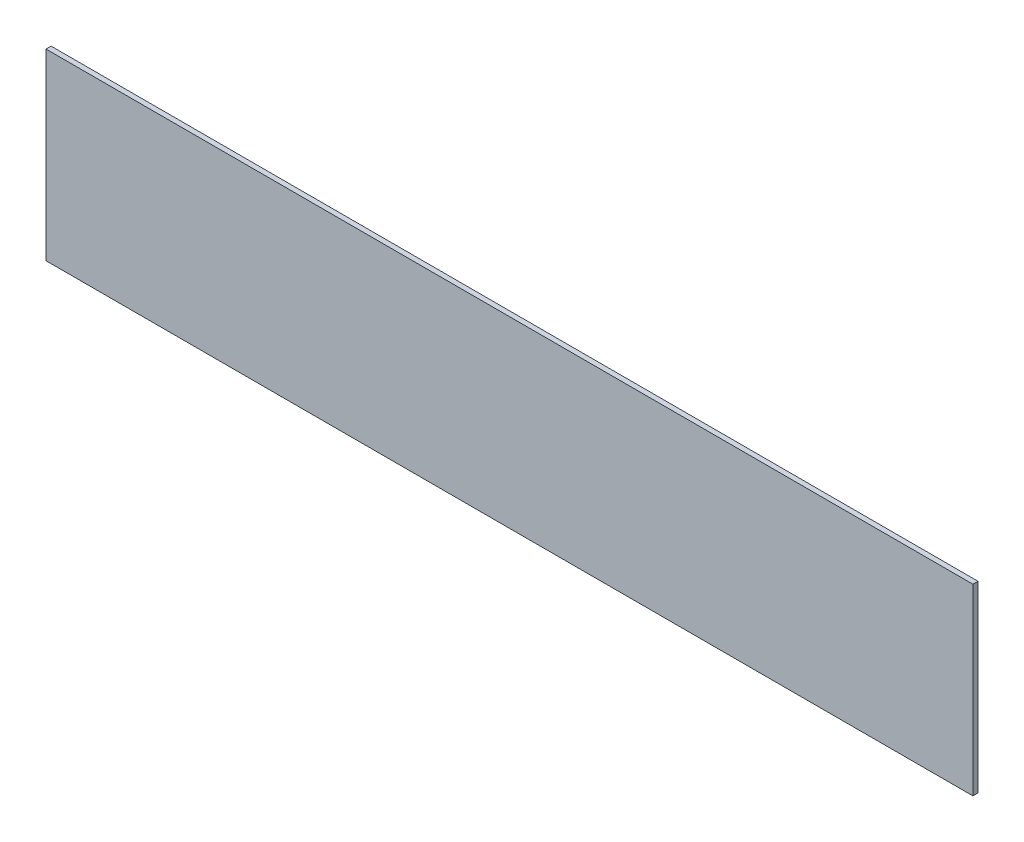
ISO-10303-21;
HEADER;
FILE_DESCRIPTION(('STEP AP214'),'2;1');
FILE_NAME('part.step','',(''),(''),'','','');
FILE_SCHEMA(('AUTOMOTIVE_DESIGN { 1 0 10303 214 1 1 1 1 }'));
ENDSEC;
DATA;
#1=APPLICATION_CONTEXT('core data for automotive mechanical design processes');
#2=APPLICATION_PROTOCOL_DEFINITION('international standard','automotive_design',2000,#1);
#3=PRODUCT_CONTEXT('',#1,'mechanical');
#4=PRODUCT('Part','Part','',(#3));
#5=PRODUCT_RELATED_PRODUCT_CATEGORY('part','',(#4));
#6=PRODUCT_DEFINITION_FORMATION('','',#4);
#7=PRODUCT_DEFINITION_CONTEXT('part definition',#1,'design');
#8=PRODUCT_DEFINITION('design','',#6,#7);
#9=PRODUCT_DEFINITION_SHAPE('','',#8);
#10=(LENGTH_UNIT() NAMED_UNIT(*) SI_UNIT(.MILLI.,.METRE.));
#11=(NAMED_UNIT(*) PLANE_ANGLE_UNIT() SI_UNIT($,.RADIAN.));
#12=(NAMED_UNIT(*) SI_UNIT($,.STERADIAN.) SOLID_ANGLE_UNIT());
#13=UNCERTAINTY_MEASURE_WITH_UNIT(LENGTH_MEASURE(1.E-05),#10,'distance_accuracy_value','');
#14=(GEOMETRIC_REPRESENTATION_CONTEXT(3) GLOBAL_UNCERTAINTY_ASSIGNED_CONTEXT((#13)) GLOBAL_UNIT_ASSIGNED_CONTEXT((#10,
#11,#12)) REPRESENTATION_CONTEXT('',''));
#15=CARTESIAN_POINT('',(0.,0.,0.));
#16=DIRECTION('',(0.,0.,1.));
#17=DIRECTION('',(1.,0.,0.));
#18=AXIS2_PLACEMENT_3D('',#15,#16,#17);
#19=CARTESIAN_POINT('',(259.,1737.,27.));
#20=DIRECTION('',(1.,0.,0.));
#21=DIRECTION('',(0.,0.,-1.));
#22=AXIS2_PLACEMENT_3D('',#19,#20,#21);
#23=PLANE('',#22);
#24=DIRECTION('',(0.,-1.,0.));
#25=VECTOR('',#24,1.);
#26=CARTESIAN_POINT('',(259.,1737.,26.));
#27=LINE('',#26,#25);
#28=CARTESIAN_POINT('',(259.,1773.,26.));
#29=VERTEX_POINT('',#28);
#30=CARTESIAN_POINT('',(259.,1737.,26.));
#31=VERTEX_POINT('',#30);
#32=EDGE_CURVE('E102',#29,#31,#27,.T.);
#33=ORIENTED_EDGE('',*,*,#32,.T.);
#34=DIRECTION('',(0.,0.,-1.));
#35=VECTOR('',#34,1.);
#36=CARTESIAN_POINT('',(259.,1737.,27.));
#37=LINE('',#36,#35);
#38=CARTESIAN_POINT('',(259.,1737.,27.));
#39=VERTEX_POINT('',#38);
#40=EDGE_CURVE('E11',#39,#31,#37,.T.);
#41=ORIENTED_EDGE('',*,*,#40,.F.);
#42=DIRECTION('',(0.,-1.,0.));
#43=VECTOR('',#42,1.);
#44=CARTESIAN_POINT('',(259.,1737.,27.));
#45=LINE('',#44,#43);
#46=CARTESIAN_POINT('',(259.,1773.,27.));
#47=VERTEX_POINT('',#46);
#48=EDGE_CURVE('E90',#47,#39,#45,.T.);
#49=ORIENTED_EDGE('',*,*,#48,.F.);
#50=DIRECTION('',(0.,0.,-1.));
#51=VECTOR('',#50,1.);
#52=CARTESIAN_POINT('',(259.,1773.,27.));
#53=LINE('',#52,#51);
#54=EDGE_CURVE('E98',#47,#29,#53,.T.);
#55=ORIENTED_EDGE('',*,*,#54,.T.);
#56=EDGE_LOOP('',(#33,#41,#49,#55));
#57=FACE_BOUND('',#56,.T.);
#58=ADVANCED_FACE('F39',(#57),#23,.F.);
#59=CARTESIAN_POINT('',(259.,1737.,27.));
#60=DIRECTION('',(0.,1.,0.));
#61=DIRECTION('',(0.,0.,1.));
#62=AXIS2_PLACEMENT_3D('',#59,#60,#61);
#63=PLANE('',#62);
#64=DIRECTION('',(1.,0.,0.));
#65=VECTOR('',#64,1.);
#66=CARTESIAN_POINT('',(259.,1737.,26.));
#67=LINE('',#66,#65);
#68=CARTESIAN_POINT('',(441.,1737.,26.));
#69=VERTEX_POINT('',#68);
#70=EDGE_CURVE('E94',#31,#69,#67,.T.);
#71=ORIENTED_EDGE('',*,*,#70,.T.);
#72=DIRECTION('',(0.,0.,-1.));
#73=VECTOR('',#72,1.);
#74=CARTESIAN_POINT('',(441.,1737.,27.));
#75=LINE('',#74,#73);
#76=CARTESIAN_POINT('',(441.,1737.,27.));
#77=VERTEX_POINT('',#76);
#78=EDGE_CURVE('E47',#77,#69,#75,.T.);
#79=ORIENTED_EDGE('',*,*,#78,.F.);
#80=DIRECTION('',(1.,0.,0.));
#81=VECTOR('',#80,1.);
#82=CARTESIAN_POINT('',(259.,1737.,27.));
#83=LINE('',#82,#81);
#84=EDGE_CURVE('E85',#39,#77,#83,.T.);
#85=ORIENTED_EDGE('',*,*,#84,.F.);
#86=ORIENTED_EDGE('',*,*,#40,.T.);
#87=EDGE_LOOP('',(#71,#79,#85,#86));
#88=FACE_BOUND('',#87,.T.);
#89=ADVANCED_FACE('F93',(#88),#63,.F.);
#90=CARTESIAN_POINT('',(441.,1737.,27.));
#91=DIRECTION('',(-1.,0.,0.));
#92=DIRECTION('',(0.,0.,1.));
#93=AXIS2_PLACEMENT_3D('',#90,#91,#92);
#94=PLANE('',#93);
#95=DIRECTION('',(0.,1.,0.));
#96=VECTOR('',#95,1.);
#97=CARTESIAN_POINT('',(441.,1737.,26.));
#98=LINE('',#97,#96);
#99=CARTESIAN_POINT('',(441.,1773.,26.));
#100=VERTEX_POINT('',#99);
#101=EDGE_CURVE('E72',#69,#100,#98,.T.);
#102=ORIENTED_EDGE('',*,*,#101,.T.);
#103=DIRECTION('',(0.,0.,-1.));
#104=VECTOR('',#103,1.);
#105=CARTESIAN_POINT('',(441.,1773.,27.));
#106=LINE('',#105,#104);
#107=CARTESIAN_POINT('',(441.,1773.,27.));
#108=VERTEX_POINT('',#107);
#109=EDGE_CURVE('E95',#108,#100,#106,.T.);
#110=ORIENTED_EDGE('',*,*,#109,.F.);
#111=DIRECTION('',(0.,1.,0.));
#112=VECTOR('',#111,1.);
#113=CARTESIAN_POINT('',(441.,1737.,27.));
#114=LINE('',#113,#112);
#115=EDGE_CURVE('E88',#77,#108,#114,.T.);
#116=ORIENTED_EDGE('',*,*,#115,.F.);
#117=ORIENTED_EDGE('',*,*,#78,.T.);
#118=EDGE_LOOP('',(#102,#110,#116,#117));
#119=FACE_BOUND('',#118,.T.);
#120=ADVANCED_FACE('F96',(#119),#94,.F.);
#121=CARTESIAN_POINT('',(259.,1773.,27.));
#122=DIRECTION('',(0.,-1.,0.));
#123=DIRECTION('',(0.,0.,-1.));
#124=AXIS2_PLACEMENT_3D('',#121,#122,#123);
#125=PLANE('',#124);
#126=DIRECTION('',(-1.,0.,0.));
#127=VECTOR('',#126,1.);
#128=CARTESIAN_POINT('',(259.,1773.,26.));
#129=LINE('',#128,#127);
#130=EDGE_CURVE('E78',#100,#29,#129,.T.);
#131=ORIENTED_EDGE('',*,*,#130,.T.);
#132=ORIENTED_EDGE('',*,*,#54,.F.);
#133=DIRECTION('',(-1.,0.,0.));
#134=VECTOR('',#133,1.);
#135=CARTESIAN_POINT('',(259.,1773.,27.));
#136=LINE('',#135,#134);
#137=EDGE_CURVE('E55',#108,#47,#136,.T.);
#138=ORIENTED_EDGE('',*,*,#137,.F.);
#139=ORIENTED_EDGE('',*,*,#109,.T.);
#140=EDGE_LOOP('',(#131,#132,#138,#139));
#141=FACE_BOUND('',#140,.T.);
#142=ADVANCED_FACE('F109',(#141),#125,.F.);
#143=CARTESIAN_POINT('',(0.,0.,27.));
#144=DIRECTION('',(0.,0.,-1.));
#145=DIRECTION('',(-1.,0.,0.));
#146=AXIS2_PLACEMENT_3D('',#143,#144,#145);
#147=PLANE('',#146);
#148=ORIENTED_EDGE('',*,*,#48,.T.);
#149=ORIENTED_EDGE('',*,*,#84,.T.);
#150=ORIENTED_EDGE('',*,*,#115,.T.);
#151=ORIENTED_EDGE('',*,*,#137,.T.);
#152=EDGE_LOOP('',(#148,#149,#150,#151));
#153=FACE_BOUND('',#152,.T.);
#154=ADVANCED_FACE('F86',(#153),#147,.F.);
#155=CARTESIAN_POINT('',(0.,0.,26.));
#156=DIRECTION('',(0.,0.,-1.));
#157=DIRECTION('',(-1.,0.,0.));
#158=AXIS2_PLACEMENT_3D('',#155,#156,#157);
#159=PLANE('',#158);
#160=ORIENTED_EDGE('',*,*,#32,.F.);
#161=ORIENTED_EDGE('',*,*,#130,.F.);
#162=ORIENTED_EDGE('',*,*,#101,.F.);
#163=ORIENTED_EDGE('',*,*,#70,.F.);
#164=EDGE_LOOP('',(#160,#161,#162,#163));
#165=FACE_BOUND('',#164,.T.);
#166=ADVANCED_FACE('F112',(#165),#159,.T.);
#167=CLOSED_SHELL('',(#58,#89,#120,#142,#154,#166));
#168=MANIFOLD_SOLID_BREP('B2',#167);
#169=ADVANCED_BREP_SHAPE_REPRESENTATION('',(#18,#168),#14);
#170=SHAPE_DEFINITION_REPRESENTATION(#9,#169);
ENDSEC;
END-ISO-10303-21;
